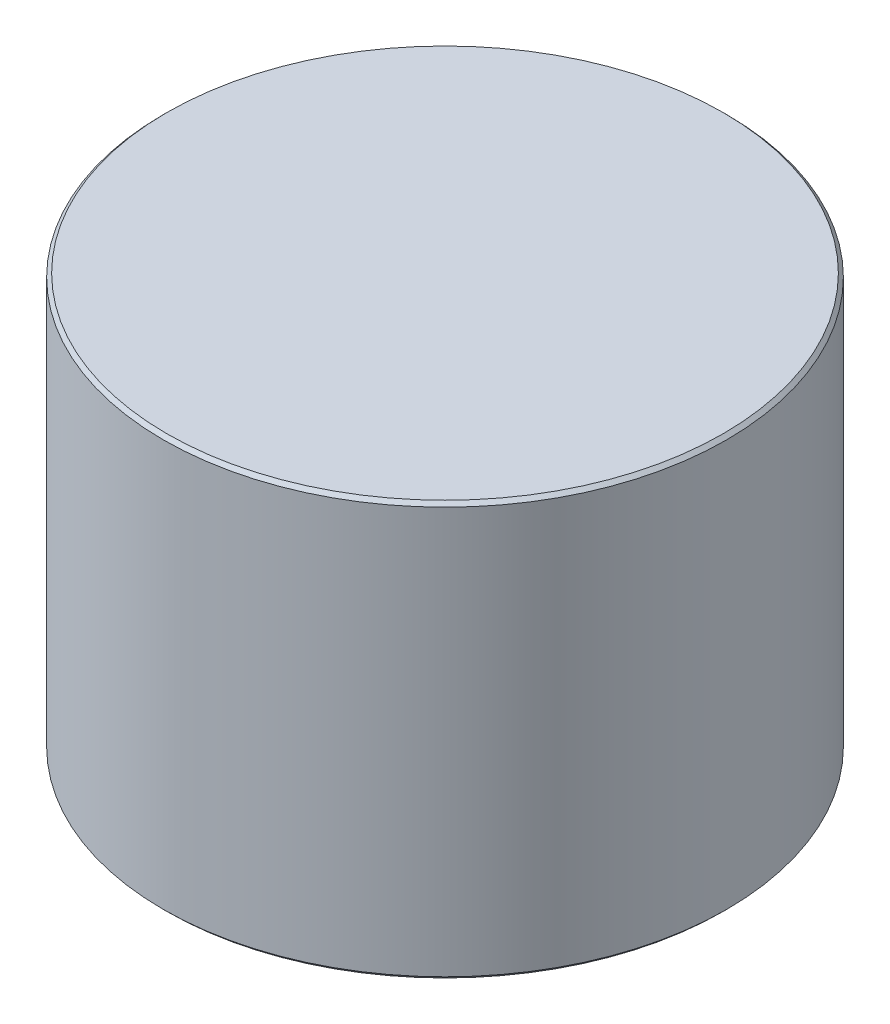
ISO-10303-21;
HEADER;
FILE_DESCRIPTION(('STEP AP214'),'2;1');
FILE_NAME('part.step','',(''),(''),'','','');
FILE_SCHEMA(('AUTOMOTIVE_DESIGN { 1 0 10303 214 1 1 1 1 }'));
ENDSEC;
DATA;
#1=APPLICATION_CONTEXT('core data for automotive mechanical design processes');
#2=APPLICATION_PROTOCOL_DEFINITION('international standard','automotive_design',2000,#1);
#3=PRODUCT_CONTEXT('',#1,'mechanical');
#4=PRODUCT('Part','Part','',(#3));
#5=PRODUCT_RELATED_PRODUCT_CATEGORY('part','',(#4));
#6=PRODUCT_DEFINITION_FORMATION('','',#4);
#7=PRODUCT_DEFINITION_CONTEXT('part definition',#1,'design');
#8=PRODUCT_DEFINITION('design','',#6,#7);
#9=PRODUCT_DEFINITION_SHAPE('','',#8);
#10=(LENGTH_UNIT() NAMED_UNIT(*) SI_UNIT(.MILLI.,.METRE.));
#11=(NAMED_UNIT(*) PLANE_ANGLE_UNIT() SI_UNIT($,.RADIAN.));
#12=(NAMED_UNIT(*) SI_UNIT($,.STERADIAN.) SOLID_ANGLE_UNIT());
#13=UNCERTAINTY_MEASURE_WITH_UNIT(LENGTH_MEASURE(1.E-05),#10,'distance_accuracy_value','');
#14=(GEOMETRIC_REPRESENTATION_CONTEXT(3) GLOBAL_UNCERTAINTY_ASSIGNED_CONTEXT((#13)) GLOBAL_UNIT_ASSIGNED_CONTEXT((#10,
#11,#12)) REPRESENTATION_CONTEXT('',''));
#15=CARTESIAN_POINT('',(0.,0.,0.));
#16=DIRECTION('',(0.,0.,1.));
#17=DIRECTION('',(1.,0.,0.));
#18=AXIS2_PLACEMENT_3D('',#15,#16,#17);
#19=CARTESIAN_POINT('',(0.,23.5,0.));
#20=DIRECTION('',(0.,1.,0.));
#21=DIRECTION('',(0.,0.,1.));
#22=AXIS2_PLACEMENT_3D('',#19,#20,#21);
#23=PLANE('',#22);
#24=CARTESIAN_POINT('',(0.,23.5,0.));
#25=DIRECTION('',(0.,-1.,0.));
#26=DIRECTION('',(0.,0.,-1.));
#27=AXIS2_PLACEMENT_3D('',#24,#25,#26);
#28=CIRCLE('',#27,15.8);
#29=CARTESIAN_POINT('',(0.,23.5,-15.8));
#30=VERTEX_POINT('',#29);
#31=EDGE_CURVE('E25',#30,#30,#28,.T.);
#32=ORIENTED_EDGE('',*,*,#31,.F.);
#33=EDGE_LOOP('',(#32));
#34=FACE_BOUND('',#33,.T.);
#35=ADVANCED_FACE('F22',(#34),#23,.T.);
#36=CARTESIAN_POINT('',(0.,0.,0.));
#37=DIRECTION('',(0.,1.,0.));
#38=DIRECTION('',(0.,0.,1.));
#39=AXIS2_PLACEMENT_3D('',#36,#37,#38);
#40=PLANE('',#39);
#41=CARTESIAN_POINT('',(0.,0.,0.));
#42=DIRECTION('',(0.,1.,0.));
#43=DIRECTION('',(0.,0.,1.));
#44=AXIS2_PLACEMENT_3D('',#41,#42,#43);
#45=CIRCLE('',#44,15.8);
#46=CARTESIAN_POINT('',(0.,0.,15.8));
#47=VERTEX_POINT('',#46);
#48=EDGE_CURVE('E34',#47,#47,#45,.T.);
#49=ORIENTED_EDGE('',*,*,#48,.F.);
#50=EDGE_LOOP('',(#49));
#51=FACE_BOUND('',#50,.T.);
#52=ADVANCED_FACE('F45',(#51),#40,.F.);
#53=CARTESIAN_POINT('',(0.,23.3,0.));
#54=DIRECTION('',(0.,-1.,0.));
#55=DIRECTION('',(0.,0.,-1.));
#56=AXIS2_PLACEMENT_3D('',#53,#54,#55);
#57=CONICAL_SURFACE('',#56,16.,0.785398163397292);
#58=CARTESIAN_POINT('',(0.,23.3,0.));
#59=DIRECTION('',(0.,-1.,0.));
#60=DIRECTION('',(0.,0.,-1.));
#61=AXIS2_PLACEMENT_3D('',#58,#59,#60);
#62=CIRCLE('',#61,16.);
#63=CARTESIAN_POINT('',(0.,23.3,-16.));
#64=VERTEX_POINT('',#63);
#65=EDGE_CURVE('E29',#64,#64,#62,.T.);
#66=ORIENTED_EDGE('',*,*,#65,.F.);
#67=EDGE_LOOP('',(#66));
#68=FACE_BOUND('',#67,.T.);
#69=ORIENTED_EDGE('',*,*,#31,.T.);
#70=EDGE_LOOP('',(#69));
#71=FACE_BOUND('',#70,.T.);
#72=ADVANCED_FACE('F42',(#68,#71),#57,.T.);
#73=CARTESIAN_POINT('',(0.,0.200000000000012,0.));
#74=DIRECTION('',(0.,1.,0.));
#75=DIRECTION('',(0.,0.,1.));
#76=AXIS2_PLACEMENT_3D('',#73,#74,#75);
#77=CONICAL_SURFACE('',#76,16.,0.785398163397301);
#78=CARTESIAN_POINT('',(0.,0.199999999999999,0.));
#79=DIRECTION('',(0.,-1.,0.));
#80=DIRECTION('',(0.,0.,-1.));
#81=AXIS2_PLACEMENT_3D('',#78,#79,#80);
#82=CIRCLE('',#81,16.);
#83=CARTESIAN_POINT('',(0.,0.199999999999999,-16.));
#84=VERTEX_POINT('',#83);
#85=EDGE_CURVE('E12',#84,#84,#82,.F.);
#86=ORIENTED_EDGE('',*,*,#85,.F.);
#87=EDGE_LOOP('',(#86));
#88=FACE_BOUND('',#87,.T.);
#89=ORIENTED_EDGE('',*,*,#48,.T.);
#90=EDGE_LOOP('',(#89));
#91=FACE_BOUND('',#90,.T.);
#92=ADVANCED_FACE('F53',(#88,#91),#77,.T.);
#93=CARTESIAN_POINT('',(0.,23.5,0.));
#94=DIRECTION('',(0.,-1.,0.));
#95=DIRECTION('',(0.,0.,-1.));
#96=AXIS2_PLACEMENT_3D('',#93,#94,#95);
#97=CYLINDRICAL_SURFACE('',#96,16.);
#98=ORIENTED_EDGE('',*,*,#85,.T.);
#99=EDGE_LOOP('',(#98));
#100=FACE_BOUND('',#99,.T.);
#101=ORIENTED_EDGE('',*,*,#65,.T.);
#102=EDGE_LOOP('',(#101));
#103=FACE_BOUND('',#102,.T.);
#104=ADVANCED_FACE('F51',(#100,#103),#97,.T.);
#105=CLOSED_SHELL('',(#35,#52,#72,#92,#104));
#106=MANIFOLD_SOLID_BREP('B1',#105);
#107=ADVANCED_BREP_SHAPE_REPRESENTATION('',(#18,#106),#14);
#108=SHAPE_DEFINITION_REPRESENTATION(#9,#107);
ENDSEC;
END-ISO-10303-21;
